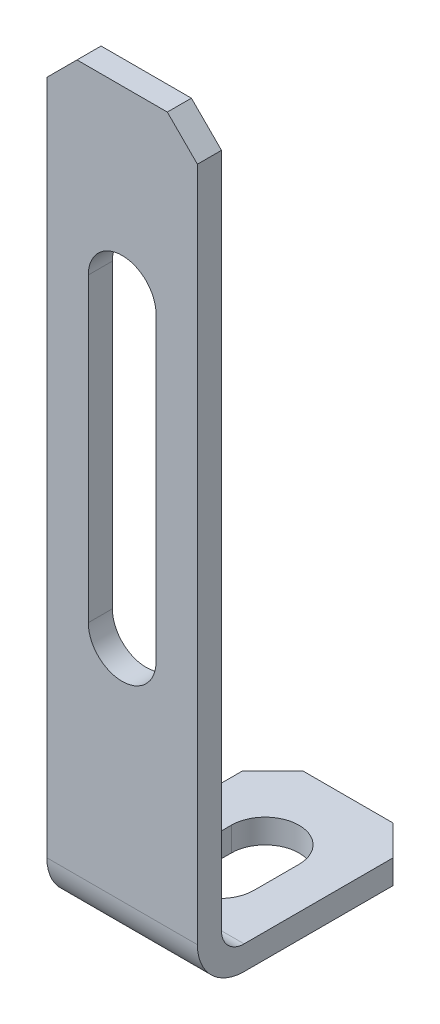
ISO-10303-21;
HEADER;
FILE_DESCRIPTION(('STEP AP214'),'2;1');
FILE_NAME('part.step','',(''),(''),'','','');
FILE_SCHEMA(('AUTOMOTIVE_DESIGN { 1 0 10303 214 1 1 1 1 }'));
ENDSEC;
DATA;
#1=APPLICATION_CONTEXT('core data for automotive mechanical design processes');
#2=APPLICATION_PROTOCOL_DEFINITION('international standard','automotive_design',2000,#1);
#3=PRODUCT_CONTEXT('',#1,'mechanical');
#4=PRODUCT('Part','Part','',(#3));
#5=PRODUCT_RELATED_PRODUCT_CATEGORY('part','',(#4));
#6=PRODUCT_DEFINITION_FORMATION('','',#4);
#7=PRODUCT_DEFINITION_CONTEXT('part definition',#1,'design');
#8=PRODUCT_DEFINITION('design','',#6,#7);
#9=PRODUCT_DEFINITION_SHAPE('','',#8);
#10=(LENGTH_UNIT() NAMED_UNIT(*) SI_UNIT(.MILLI.,.METRE.));
#11=(NAMED_UNIT(*) PLANE_ANGLE_UNIT() SI_UNIT($,.RADIAN.));
#12=(NAMED_UNIT(*) SI_UNIT($,.STERADIAN.) SOLID_ANGLE_UNIT());
#13=UNCERTAINTY_MEASURE_WITH_UNIT(LENGTH_MEASURE(1.E-05),#10,'distance_accuracy_value','');
#14=(GEOMETRIC_REPRESENTATION_CONTEXT(3) GLOBAL_UNCERTAINTY_ASSIGNED_CONTEXT((#13)) GLOBAL_UNIT_ASSIGNED_CONTEXT((#10,
#11,#12)) REPRESENTATION_CONTEXT('',''));
#15=CARTESIAN_POINT('',(0.,0.,0.));
#16=DIRECTION('',(0.,0.,1.));
#17=DIRECTION('',(1.,0.,0.));
#18=AXIS2_PLACEMENT_3D('',#15,#16,#17);
#19=CARTESIAN_POINT('',(0.,50.,-15.));
#20=DIRECTION('',(0.,1.,0.));
#21=DIRECTION('',(0.,0.,1.));
#22=AXIS2_PLACEMENT_3D('',#19,#20,#21);
#23=PLANE('',#22);
#24=DIRECTION('',(-1.,0.,0.));
#25=VECTOR('',#24,1.);
#26=CARTESIAN_POINT('',(10.,50.,-1.6));
#27=LINE('',#26,#25);
#28=CARTESIAN_POINT('',(7.99999999999999,50.,-1.6));
#29=VERTEX_POINT('',#28);
#30=CARTESIAN_POINT('',(1.99999999999998,50.,-1.6));
#31=VERTEX_POINT('',#30);
#32=EDGE_CURVE('E245',#29,#31,#27,.T.);
#33=ORIENTED_EDGE('',*,*,#32,.T.);
#34=DIRECTION('',(0.,0.,1.));
#35=VECTOR('',#34,1.);
#36=CARTESIAN_POINT('',(1.99999999999999,50.,0.));
#37=LINE('',#36,#35);
#38=CARTESIAN_POINT('',(1.99999999999999,50.,0.));
#39=VERTEX_POINT('',#38);
#40=EDGE_CURVE('E276',#31,#39,#37,.T.);
#41=ORIENTED_EDGE('',*,*,#40,.T.);
#42=DIRECTION('',(1.,0.,0.));
#43=VECTOR('',#42,1.);
#44=CARTESIAN_POINT('',(0.,50.,0.));
#45=LINE('',#44,#43);
#46=CARTESIAN_POINT('',(7.99999999999999,50.,0.));
#47=VERTEX_POINT('',#46);
#48=EDGE_CURVE('E257',#39,#47,#45,.T.);
#49=ORIENTED_EDGE('',*,*,#48,.T.);
#50=DIRECTION('',(0.,0.,-1.));
#51=VECTOR('',#50,1.);
#52=CARTESIAN_POINT('',(7.99999999999999,50.,-15.));
#53=LINE('',#52,#51);
#54=EDGE_CURVE('E274',#47,#29,#53,.T.);
#55=ORIENTED_EDGE('',*,*,#54,.T.);
#56=EDGE_LOOP('',(#33,#41,#49,#55));
#57=FACE_BOUND('',#56,.T.);
#58=ADVANCED_FACE('F32',(#57),#23,.T.);
#59=CARTESIAN_POINT('',(0.,0.,-15.));
#60=DIRECTION('',(0.,0.,-1.));
#61=DIRECTION('',(-1.,0.,0.));
#62=AXIS2_PLACEMENT_3D('',#59,#60,#61);
#63=PLANE('',#62);
#64=DIRECTION('',(1.,0.,0.));
#65=VECTOR('',#64,1.);
#66=CARTESIAN_POINT('',(0.,0.,-15.));
#67=LINE('',#66,#65);
#68=CARTESIAN_POINT('',(1.99999999999998,0.,-15.));
#69=VERTEX_POINT('',#68);
#70=CARTESIAN_POINT('',(7.99999999999999,0.,-15.));
#71=VERTEX_POINT('',#70);
#72=EDGE_CURVE('E260',#69,#71,#67,.T.);
#73=ORIENTED_EDGE('',*,*,#72,.F.);
#74=DIRECTION('',(0.,1.,0.));
#75=VECTOR('',#74,1.);
#76=CARTESIAN_POINT('',(1.99999999999999,1.6,-15.));
#77=LINE('',#76,#75);
#78=CARTESIAN_POINT('',(1.99999999999998,1.6,-15.));
#79=VERTEX_POINT('',#78);
#80=EDGE_CURVE('E296',#69,#79,#77,.T.);
#81=ORIENTED_EDGE('',*,*,#80,.T.);
#82=DIRECTION('',(-1.,0.,0.));
#83=VECTOR('',#82,1.);
#84=CARTESIAN_POINT('',(10.,1.6,-15.));
#85=LINE('',#84,#83);
#86=CARTESIAN_POINT('',(7.99999999999999,1.6,-15.));
#87=VERTEX_POINT('',#86);
#88=EDGE_CURVE('E241',#87,#79,#85,.T.);
#89=ORIENTED_EDGE('',*,*,#88,.F.);
#90=DIRECTION('',(0.,-1.,0.));
#91=VECTOR('',#90,1.);
#92=CARTESIAN_POINT('',(7.99999999999999,0.,-15.));
#93=LINE('',#92,#91);
#94=EDGE_CURVE('E294',#87,#71,#93,.T.);
#95=ORIENTED_EDGE('',*,*,#94,.T.);
#96=EDGE_LOOP('',(#73,#81,#89,#95));
#97=FACE_BOUND('',#96,.T.);
#98=ADVANCED_FACE('F356',(#97),#63,.T.);
#99=CARTESIAN_POINT('',(0.,0.,0.));
#100=DIRECTION('',(0.,-1.,0.));
#101=DIRECTION('',(0.,0.,-1.));
#102=AXIS2_PLACEMENT_3D('',#99,#100,#101);
#103=PLANE('',#102);
#104=CARTESIAN_POINT('',(5.,0.,-9.5));
#105=DIRECTION('',(0.,1.,0.));
#106=DIRECTION('',(0.,0.,1.));
#107=AXIS2_PLACEMENT_3D('',#104,#105,#106);
#108=CIRCLE('',#107,2.25);
#109=CARTESIAN_POINT('',(7.25,0.,-9.5));
#110=VERTEX_POINT('',#109);
#111=CARTESIAN_POINT('',(2.75,0.,-9.5));
#112=VERTEX_POINT('',#111);
#113=EDGE_CURVE('E203',#110,#112,#108,.T.);
#114=ORIENTED_EDGE('',*,*,#113,.T.);
#115=DIRECTION('',(0.,0.,1.));
#116=VECTOR('',#115,1.);
#117=CARTESIAN_POINT('',(2.75,0.,-9.5));
#118=LINE('',#117,#116);
#119=CARTESIAN_POINT('',(2.75,0.,-6.5));
#120=VERTEX_POINT('',#119);
#121=EDGE_CURVE('E206',#112,#120,#118,.T.);
#122=ORIENTED_EDGE('',*,*,#121,.T.);
#123=CARTESIAN_POINT('',(5.,0.,-6.5));
#124=DIRECTION('',(0.,1.,0.));
#125=DIRECTION('',(0.,0.,1.));
#126=AXIS2_PLACEMENT_3D('',#123,#124,#125);
#127=CIRCLE('',#126,2.25);
#128=CARTESIAN_POINT('',(7.25,0.,-6.5));
#129=VERTEX_POINT('',#128);
#130=EDGE_CURVE('E210',#120,#129,#127,.T.);
#131=ORIENTED_EDGE('',*,*,#130,.T.);
#132=DIRECTION('',(0.,0.,-1.));
#133=VECTOR('',#132,1.);
#134=CARTESIAN_POINT('',(7.25,0.,-6.5));
#135=LINE('',#134,#133);
#136=EDGE_CURVE('E213',#129,#110,#135,.T.);
#137=ORIENTED_EDGE('',*,*,#136,.T.);
#138=EDGE_LOOP('',(#114,#122,#131,#137));
#139=FACE_BOUND('',#138,.T.);
#140=DIRECTION('',(0.,0.,-1.));
#141=VECTOR('',#140,1.);
#142=CARTESIAN_POINT('',(10.,0.,0.));
#143=LINE('',#142,#141);
#144=CARTESIAN_POINT('',(10.,0.,-3.1));
#145=VERTEX_POINT('',#144);
#146=CARTESIAN_POINT('',(10.,0.,-13.));
#147=VERTEX_POINT('',#146);
#148=EDGE_CURVE('E255',#145,#147,#143,.T.);
#149=ORIENTED_EDGE('',*,*,#148,.F.);
#150=DIRECTION('',(1.,0.,0.));
#151=VECTOR('',#150,1.);
#152=CARTESIAN_POINT('',(0.,0.,-3.1));
#153=LINE('',#152,#151);
#154=CARTESIAN_POINT('',(0.,0.,-3.1));
#155=VERTEX_POINT('',#154);
#156=EDGE_CURVE('E40',#145,#155,#153,.F.);
#157=ORIENTED_EDGE('',*,*,#156,.T.);
#158=DIRECTION('',(0.,0.,-1.));
#159=VECTOR('',#158,1.);
#160=CARTESIAN_POINT('',(0.,0.,0.));
#161=LINE('',#160,#159);
#162=CARTESIAN_POINT('',(0.,0.,-13.));
#163=VERTEX_POINT('',#162);
#164=EDGE_CURVE('E254',#155,#163,#161,.T.);
#165=ORIENTED_EDGE('',*,*,#164,.T.);
#166=DIRECTION('',(0.707106781186544,0.,-0.707106781186551));
#167=VECTOR('',#166,1.);
#168=CARTESIAN_POINT('',(-6.5,0.,-6.49999999999993));
#169=LINE('',#168,#167);
#170=EDGE_CURVE('E306',#163,#69,#169,.T.);
#171=ORIENTED_EDGE('',*,*,#170,.T.);
#172=ORIENTED_EDGE('',*,*,#72,.T.);
#173=DIRECTION('',(-0.707106781186551,0.,-0.707106781186544));
#174=VECTOR('',#173,1.);
#175=CARTESIAN_POINT('',(11.5,0.,-11.5000000000001));
#176=LINE('',#175,#174);
#177=EDGE_CURVE('E303',#71,#147,#176,.F.);
#178=ORIENTED_EDGE('',*,*,#177,.T.);
#179=EDGE_LOOP('',(#149,#157,#165,#171,#172,#178));
#180=FACE_BOUND('',#179,.T.);
#181=ADVANCED_FACE('F361',(#139,#180),#103,.T.);
#182=CARTESIAN_POINT('',(0.,50.,0.));
#183=DIRECTION('',(0.,0.,1.));
#184=DIRECTION('',(1.,0.,0.));
#185=AXIS2_PLACEMENT_3D('',#182,#183,#184);
#186=PLANE('',#185);
#187=CARTESIAN_POINT('',(5.,18.,0.));
#188=DIRECTION('',(0.,0.,1.));
#189=DIRECTION('',(1.,0.,0.));
#190=AXIS2_PLACEMENT_3D('',#187,#188,#189);
#191=CIRCLE('',#190,2.25);
#192=CARTESIAN_POINT('',(2.75,18.,0.));
#193=VERTEX_POINT('',#192);
#194=CARTESIAN_POINT('',(7.25,18.,0.));
#195=VERTEX_POINT('',#194);
#196=EDGE_CURVE('E188',#193,#195,#191,.T.);
#197=ORIENTED_EDGE('',*,*,#196,.F.);
#198=DIRECTION('',(0.,-1.,0.));
#199=VECTOR('',#198,1.);
#200=CARTESIAN_POINT('',(2.75,38.,0.));
#201=LINE('',#200,#199);
#202=CARTESIAN_POINT('',(2.75,38.,0.));
#203=VERTEX_POINT('',#202);
#204=EDGE_CURVE('E193',#203,#193,#201,.T.);
#205=ORIENTED_EDGE('',*,*,#204,.F.);
#206=CARTESIAN_POINT('',(5.,38.,0.));
#207=DIRECTION('',(0.,0.,1.));
#208=DIRECTION('',(1.,0.,0.));
#209=AXIS2_PLACEMENT_3D('',#206,#207,#208);
#210=CIRCLE('',#209,2.25);
#211=CARTESIAN_POINT('',(7.25,38.,0.));
#212=VERTEX_POINT('',#211);
#213=EDGE_CURVE('E172',#212,#203,#210,.T.);
#214=ORIENTED_EDGE('',*,*,#213,.F.);
#215=DIRECTION('',(0.,1.,0.));
#216=VECTOR('',#215,1.);
#217=CARTESIAN_POINT('',(7.25,18.,0.));
#218=LINE('',#217,#216);
#219=EDGE_CURVE('E183',#195,#212,#218,.T.);
#220=ORIENTED_EDGE('',*,*,#219,.F.);
#221=EDGE_LOOP('',(#197,#205,#214,#220));
#222=FACE_BOUND('',#221,.T.);
#223=DIRECTION('',(0.,-1.,0.));
#224=VECTOR('',#223,1.);
#225=CARTESIAN_POINT('',(0.,50.,0.));
#226=LINE('',#225,#224);
#227=CARTESIAN_POINT('',(0.,48.,0.));
#228=VERTEX_POINT('',#227);
#229=CARTESIAN_POINT('',(0.,3.1,0.));
#230=VERTEX_POINT('',#229);
#231=EDGE_CURVE('E251',#228,#230,#226,.T.);
#232=ORIENTED_EDGE('',*,*,#231,.T.);
#233=DIRECTION('',(1.,0.,0.));
#234=VECTOR('',#233,1.);
#235=CARTESIAN_POINT('',(0.,3.1,0.));
#236=LINE('',#235,#234);
#237=CARTESIAN_POINT('',(10.,3.1,0.));
#238=VERTEX_POINT('',#237);
#239=EDGE_CURVE('E323',#230,#238,#236,.T.);
#240=ORIENTED_EDGE('',*,*,#239,.T.);
#241=DIRECTION('',(0.,-1.,0.));
#242=VECTOR('',#241,1.);
#243=CARTESIAN_POINT('',(10.,50.,0.));
#244=LINE('',#243,#242);
#245=CARTESIAN_POINT('',(10.,48.,0.));
#246=VERTEX_POINT('',#245);
#247=EDGE_CURVE('E248',#246,#238,#244,.T.);
#248=ORIENTED_EDGE('',*,*,#247,.F.);
#249=DIRECTION('',(0.707106781186551,-0.707106781186544,0.));
#250=VECTOR('',#249,1.);
#251=CARTESIAN_POINT('',(3.99999999999995,54.,0.));
#252=LINE('',#251,#250);
#253=EDGE_CURVE('E279',#246,#47,#252,.F.);
#254=ORIENTED_EDGE('',*,*,#253,.T.);
#255=ORIENTED_EDGE('',*,*,#48,.F.);
#256=DIRECTION('',(-0.707106781186544,-0.707106781186551,0.));
#257=VECTOR('',#256,1.);
#258=CARTESIAN_POINT('',(1.,49.,0.));
#259=LINE('',#258,#257);
#260=EDGE_CURVE('E281',#39,#228,#259,.T.);
#261=ORIENTED_EDGE('',*,*,#260,.T.);
#262=EDGE_LOOP('',(#232,#240,#248,#254,#255,#261));
#263=FACE_BOUND('',#262,.T.);
#264=ADVANCED_FACE('F190',(#222,#263),#186,.T.);
#265=CARTESIAN_POINT('',(0.,0.,0.));
#266=DIRECTION('',(1.,0.,0.));
#267=DIRECTION('',(0.,0.,-1.));
#268=AXIS2_PLACEMENT_3D('',#265,#266,#267);
#269=PLANE('',#268);
#270=ORIENTED_EDGE('',*,*,#164,.F.);
#271=CARTESIAN_POINT('',(0.,3.1,-3.1));
#272=DIRECTION('',(1.,0.,0.));
#273=DIRECTION('',(0.,0.,-1.));
#274=AXIS2_PLACEMENT_3D('',#271,#272,#273);
#275=CIRCLE('',#274,3.1);
#276=EDGE_CURVE('E11',#155,#230,#275,.F.);
#277=ORIENTED_EDGE('',*,*,#276,.T.);
#278=ORIENTED_EDGE('',*,*,#231,.F.);
#279=DIRECTION('',(0.,0.,-1.));
#280=VECTOR('',#279,1.);
#281=CARTESIAN_POINT('',(0.,48.,-1.6));
#282=LINE('',#281,#280);
#283=CARTESIAN_POINT('',(0.,48.,-1.6));
#284=VERTEX_POINT('',#283);
#285=EDGE_CURVE('E286',#228,#284,#282,.T.);
#286=ORIENTED_EDGE('',*,*,#285,.T.);
#287=DIRECTION('',(0.,1.,0.));
#288=VECTOR('',#287,1.);
#289=CARTESIAN_POINT('',(0.,1.6,-1.6));
#290=LINE('',#289,#288);
#291=CARTESIAN_POINT('',(0.,3.1,-1.6));
#292=VERTEX_POINT('',#291);
#293=EDGE_CURVE('E239',#292,#284,#290,.T.);
#294=ORIENTED_EDGE('',*,*,#293,.F.);
#295=CARTESIAN_POINT('',(0.,3.1,-3.1));
#296=DIRECTION('',(1.,0.,0.));
#297=DIRECTION('',(0.,0.,-1.));
#298=AXIS2_PLACEMENT_3D('',#295,#296,#297);
#299=CIRCLE('',#298,1.5);
#300=CARTESIAN_POINT('',(0.,1.6,-3.1));
#301=VERTEX_POINT('',#300);
#302=EDGE_CURVE('E319',#292,#301,#299,.T.);
#303=ORIENTED_EDGE('',*,*,#302,.T.);
#304=DIRECTION('',(0.,0.,1.));
#305=VECTOR('',#304,1.);
#306=CARTESIAN_POINT('',(0.,1.6,-15.));
#307=LINE('',#306,#305);
#308=CARTESIAN_POINT('',(0.,1.6,-13.));
#309=VERTEX_POINT('',#308);
#310=EDGE_CURVE('E228',#309,#301,#307,.T.);
#311=ORIENTED_EDGE('',*,*,#310,.F.);
#312=DIRECTION('',(0.,-1.,0.));
#313=VECTOR('',#312,1.);
#314=CARTESIAN_POINT('',(0.,0.,-13.));
#315=LINE('',#314,#313);
#316=EDGE_CURVE('E283',#309,#163,#315,.T.);
#317=ORIENTED_EDGE('',*,*,#316,.T.);
#318=EDGE_LOOP('',(#270,#277,#278,#286,#294,#303,#311,#317));
#319=FACE_BOUND('',#318,.T.);
#320=ADVANCED_FACE('F347',(#319),#269,.F.);
#321=CARTESIAN_POINT('',(10.,0.,0.));
#322=DIRECTION('',(1.,0.,0.));
#323=DIRECTION('',(0.,0.,-1.));
#324=AXIS2_PLACEMENT_3D('',#321,#322,#323);
#325=PLANE('',#324);
#326=ORIENTED_EDGE('',*,*,#247,.T.);
#327=CARTESIAN_POINT('',(10.,3.1,-3.1));
#328=DIRECTION('',(1.,0.,0.));
#329=DIRECTION('',(0.,0.,-1.));
#330=AXIS2_PLACEMENT_3D('',#327,#328,#329);
#331=CIRCLE('',#330,3.1);
#332=EDGE_CURVE('E54',#238,#145,#331,.T.);
#333=ORIENTED_EDGE('',*,*,#332,.T.);
#334=ORIENTED_EDGE('',*,*,#148,.T.);
#335=DIRECTION('',(0.,1.,0.));
#336=VECTOR('',#335,1.);
#337=CARTESIAN_POINT('',(10.,0.,-13.));
#338=LINE('',#337,#336);
#339=CARTESIAN_POINT('',(10.,1.6,-13.));
#340=VERTEX_POINT('',#339);
#341=EDGE_CURVE('E311',#147,#340,#338,.T.);
#342=ORIENTED_EDGE('',*,*,#341,.T.);
#343=DIRECTION('',(0.,0.,1.));
#344=VECTOR('',#343,1.);
#345=CARTESIAN_POINT('',(10.,1.6,-15.));
#346=LINE('',#345,#344);
#347=CARTESIAN_POINT('',(10.,1.6,-3.1));
#348=VERTEX_POINT('',#347);
#349=EDGE_CURVE('E235',#340,#348,#346,.T.);
#350=ORIENTED_EDGE('',*,*,#349,.T.);
#351=CARTESIAN_POINT('',(10.,3.1,-3.1));
#352=DIRECTION('',(1.,0.,0.));
#353=DIRECTION('',(0.,0.,-1.));
#354=AXIS2_PLACEMENT_3D('',#351,#352,#353);
#355=CIRCLE('',#354,1.5);
#356=CARTESIAN_POINT('',(10.,3.1,-1.6));
#357=VERTEX_POINT('',#356);
#358=EDGE_CURVE('E321',#348,#357,#355,.F.);
#359=ORIENTED_EDGE('',*,*,#358,.T.);
#360=DIRECTION('',(0.,1.,0.));
#361=VECTOR('',#360,1.);
#362=CARTESIAN_POINT('',(10.,1.6,-1.6));
#363=LINE('',#362,#361);
#364=CARTESIAN_POINT('',(10.,48.,-1.6));
#365=VERTEX_POINT('',#364);
#366=EDGE_CURVE('E238',#357,#365,#363,.T.);
#367=ORIENTED_EDGE('',*,*,#366,.T.);
#368=DIRECTION('',(0.,0.,1.));
#369=VECTOR('',#368,1.);
#370=CARTESIAN_POINT('',(10.,48.,0.));
#371=LINE('',#370,#369);
#372=EDGE_CURVE('E308',#365,#246,#371,.T.);
#373=ORIENTED_EDGE('',*,*,#372,.T.);
#374=EDGE_LOOP('',(#326,#333,#334,#342,#350,#359,#367,#373));
#375=FACE_BOUND('',#374,.T.);
#376=ADVANCED_FACE('F331',(#375),#325,.T.);
#377=CARTESIAN_POINT('',(10.,1.6,-1.6));
#378=DIRECTION('',(0.,0.,1.));
#379=DIRECTION('',(1.,0.,0.));
#380=AXIS2_PLACEMENT_3D('',#377,#378,#379);
#381=PLANE('',#380);
#382=DIRECTION('',(0.,-1.,0.));
#383=VECTOR('',#382,1.);
#384=CARTESIAN_POINT('',(2.75,1.6,-1.6));
#385=LINE('',#384,#383);
#386=CARTESIAN_POINT('',(2.75,38.,-1.6));
#387=VERTEX_POINT('',#386);
#388=CARTESIAN_POINT('',(2.75,18.,-1.6));
#389=VERTEX_POINT('',#388);
#390=EDGE_CURVE('E268',#387,#389,#385,.T.);
#391=ORIENTED_EDGE('',*,*,#390,.T.);
#392=CARTESIAN_POINT('',(5.,18.,-1.6));
#393=DIRECTION('',(0.,0.,1.));
#394=DIRECTION('',(1.,0.,0.));
#395=AXIS2_PLACEMENT_3D('',#392,#393,#394);
#396=CIRCLE('',#395,2.25);
#397=CARTESIAN_POINT('',(7.25,18.,-1.6));
#398=VERTEX_POINT('',#397);
#399=EDGE_CURVE('E271',#389,#398,#396,.T.);
#400=ORIENTED_EDGE('',*,*,#399,.T.);
#401=DIRECTION('',(0.,1.,0.));
#402=VECTOR('',#401,1.);
#403=CARTESIAN_POINT('',(7.25,1.6,-1.6));
#404=LINE('',#403,#402);
#405=CARTESIAN_POINT('',(7.25,38.,-1.6));
#406=VERTEX_POINT('',#405);
#407=EDGE_CURVE('E263',#398,#406,#404,.T.);
#408=ORIENTED_EDGE('',*,*,#407,.T.);
#409=CARTESIAN_POINT('',(5.,38.,-1.6));
#410=DIRECTION('',(0.,0.,1.));
#411=DIRECTION('',(1.,0.,0.));
#412=AXIS2_PLACEMENT_3D('',#409,#410,#411);
#413=CIRCLE('',#412,2.25);
#414=EDGE_CURVE('E175',#406,#387,#413,.T.);
#415=ORIENTED_EDGE('',*,*,#414,.T.);
#416=EDGE_LOOP('',(#391,#400,#408,#415));
#417=FACE_BOUND('',#416,.T.);
#418=ORIENTED_EDGE('',*,*,#366,.F.);
#419=DIRECTION('',(-1.,0.,0.));
#420=VECTOR('',#419,1.);
#421=CARTESIAN_POINT('',(0.,3.1,-1.6));
#422=LINE('',#421,#420);
#423=EDGE_CURVE('E314',#357,#292,#422,.T.);
#424=ORIENTED_EDGE('',*,*,#423,.T.);
#425=ORIENTED_EDGE('',*,*,#293,.T.);
#426=DIRECTION('',(0.707106781186544,0.707106781186551,0.));
#427=VECTOR('',#426,1.);
#428=CARTESIAN_POINT('',(1.99999999999999,50.,-1.6));
#429=LINE('',#428,#427);
#430=EDGE_CURVE('E292',#284,#31,#429,.T.);
#431=ORIENTED_EDGE('',*,*,#430,.T.);
#432=ORIENTED_EDGE('',*,*,#32,.F.);
#433=DIRECTION('',(-0.707106781186551,0.707106781186544,0.));
#434=VECTOR('',#433,1.);
#435=CARTESIAN_POINT('',(10.,48.,-1.6));
#436=LINE('',#435,#434);
#437=EDGE_CURVE('E289',#29,#365,#436,.F.);
#438=ORIENTED_EDGE('',*,*,#437,.T.);
#439=EDGE_LOOP('',(#418,#424,#425,#431,#432,#438));
#440=FACE_BOUND('',#439,.T.);
#441=ADVANCED_FACE('F425',(#417,#440),#381,.F.);
#442=CARTESIAN_POINT('',(10.,1.6,-15.));
#443=DIRECTION('',(0.,-1.,0.));
#444=DIRECTION('',(0.,0.,-1.));
#445=AXIS2_PLACEMENT_3D('',#442,#443,#444);
#446=PLANE('',#445);
#447=DIRECTION('',(0.,0.,1.));
#448=VECTOR('',#447,1.);
#449=CARTESIAN_POINT('',(2.75,1.6,-9.5));
#450=LINE('',#449,#448);
#451=CARTESIAN_POINT('',(2.75,1.6,-9.5));
#452=VERTEX_POINT('',#451);
#453=CARTESIAN_POINT('',(2.75,1.6,-6.5));
#454=VERTEX_POINT('',#453);
#455=EDGE_CURVE('E218',#452,#454,#450,.T.);
#456=ORIENTED_EDGE('',*,*,#455,.F.);
#457=CARTESIAN_POINT('',(5.,1.6,-9.5));
#458=DIRECTION('',(0.,1.,0.));
#459=DIRECTION('',(0.,0.,1.));
#460=AXIS2_PLACEMENT_3D('',#457,#458,#459);
#461=CIRCLE('',#460,2.25);
#462=CARTESIAN_POINT('',(7.25,1.6,-9.5));
#463=VERTEX_POINT('',#462);
#464=EDGE_CURVE('E200',#463,#452,#461,.T.);
#465=ORIENTED_EDGE('',*,*,#464,.F.);
#466=DIRECTION('',(0.,0.,-1.));
#467=VECTOR('',#466,1.);
#468=CARTESIAN_POINT('',(7.25,1.6,-6.5));
#469=LINE('',#468,#467);
#470=CARTESIAN_POINT('',(7.25,1.6,-6.5));
#471=VERTEX_POINT('',#470);
#472=EDGE_CURVE('E207',#471,#463,#469,.T.);
#473=ORIENTED_EDGE('',*,*,#472,.F.);
#474=CARTESIAN_POINT('',(5.,1.6,-6.5));
#475=DIRECTION('',(0.,1.,0.));
#476=DIRECTION('',(0.,0.,1.));
#477=AXIS2_PLACEMENT_3D('',#474,#475,#476);
#478=CIRCLE('',#477,2.25);
#479=EDGE_CURVE('E221',#454,#471,#478,.T.);
#480=ORIENTED_EDGE('',*,*,#479,.F.);
#481=EDGE_LOOP('',(#456,#465,#473,#480));
#482=FACE_BOUND('',#481,.T.);
#483=ORIENTED_EDGE('',*,*,#310,.T.);
#484=DIRECTION('',(-1.,0.,0.));
#485=VECTOR('',#484,1.);
#486=CARTESIAN_POINT('',(10.,1.6,-3.1));
#487=LINE('',#486,#485);
#488=EDGE_CURVE('E317',#301,#348,#487,.F.);
#489=ORIENTED_EDGE('',*,*,#488,.T.);
#490=ORIENTED_EDGE('',*,*,#349,.F.);
#491=DIRECTION('',(0.707106781186551,0.,0.707106781186544));
#492=VECTOR('',#491,1.);
#493=CARTESIAN_POINT('',(10.,1.6,-13.));
#494=LINE('',#493,#492);
#495=EDGE_CURVE('E299',#340,#87,#494,.F.);
#496=ORIENTED_EDGE('',*,*,#495,.T.);
#497=ORIENTED_EDGE('',*,*,#88,.T.);
#498=DIRECTION('',(-0.707106781186544,0.,0.707106781186551));
#499=VECTOR('',#498,1.);
#500=CARTESIAN_POINT('',(1.99999999999999,1.6,-15.));
#501=LINE('',#500,#499);
#502=EDGE_CURVE('E301',#79,#309,#501,.T.);
#503=ORIENTED_EDGE('',*,*,#502,.T.);
#504=EDGE_LOOP('',(#483,#489,#490,#496,#497,#503));
#505=FACE_BOUND('',#504,.T.);
#506=ADVANCED_FACE('F394',(#482,#505),#446,.F.);
#507=CARTESIAN_POINT('',(5.,0.,-9.5));
#508=DIRECTION('',(0.,1.,0.));
#509=DIRECTION('',(0.,0.,1.));
#510=AXIS2_PLACEMENT_3D('',#507,#508,#509);
#511=CYLINDRICAL_SURFACE('',#510,2.25);
#512=ORIENTED_EDGE('',*,*,#464,.T.);
#513=DIRECTION('',(0.,1.,0.));
#514=VECTOR('',#513,1.);
#515=CARTESIAN_POINT('',(2.75,0.,-9.5));
#516=LINE('',#515,#514);
#517=EDGE_CURVE('E216',#112,#452,#516,.T.);
#518=ORIENTED_EDGE('',*,*,#517,.F.);
#519=ORIENTED_EDGE('',*,*,#113,.F.);
#520=DIRECTION('',(0.,1.,0.));
#521=VECTOR('',#520,1.);
#522=CARTESIAN_POINT('',(7.25,0.,-9.5));
#523=LINE('',#522,#521);
#524=EDGE_CURVE('E226',#110,#463,#523,.T.);
#525=ORIENTED_EDGE('',*,*,#524,.T.);
#526=EDGE_LOOP('',(#512,#518,#519,#525));
#527=FACE_BOUND('',#526,.T.);
#528=ADVANCED_FACE('F441',(#527),#511,.F.);
#529=CARTESIAN_POINT('',(7.25,0.,-6.5));
#530=DIRECTION('',(1.,0.,0.));
#531=DIRECTION('',(0.,0.,-1.));
#532=AXIS2_PLACEMENT_3D('',#529,#530,#531);
#533=PLANE('',#532);
#534=ORIENTED_EDGE('',*,*,#472,.T.);
#535=ORIENTED_EDGE('',*,*,#524,.F.);
#536=ORIENTED_EDGE('',*,*,#136,.F.);
#537=DIRECTION('',(0.,1.,0.));
#538=VECTOR('',#537,1.);
#539=CARTESIAN_POINT('',(7.25,0.,-6.5));
#540=LINE('',#539,#538);
#541=EDGE_CURVE('E229',#129,#471,#540,.T.);
#542=ORIENTED_EDGE('',*,*,#541,.T.);
#543=EDGE_LOOP('',(#534,#535,#536,#542));
#544=FACE_BOUND('',#543,.T.);
#545=ADVANCED_FACE('F447',(#544),#533,.F.);
#546=CARTESIAN_POINT('',(5.,0.,-6.5));
#547=DIRECTION('',(0.,1.,0.));
#548=DIRECTION('',(0.,0.,1.));
#549=AXIS2_PLACEMENT_3D('',#546,#547,#548);
#550=CYLINDRICAL_SURFACE('',#549,2.25);
#551=ORIENTED_EDGE('',*,*,#479,.T.);
#552=ORIENTED_EDGE('',*,*,#541,.F.);
#553=ORIENTED_EDGE('',*,*,#130,.F.);
#554=DIRECTION('',(0.,1.,0.));
#555=VECTOR('',#554,1.);
#556=CARTESIAN_POINT('',(2.75,0.,-6.5));
#557=LINE('',#556,#555);
#558=EDGE_CURVE('E231',#120,#454,#557,.T.);
#559=ORIENTED_EDGE('',*,*,#558,.T.);
#560=EDGE_LOOP('',(#551,#552,#553,#559));
#561=FACE_BOUND('',#560,.T.);
#562=ADVANCED_FACE('F455',(#561),#550,.F.);
#563=CARTESIAN_POINT('',(2.75,0.,-9.5));
#564=DIRECTION('',(-1.,0.,0.));
#565=DIRECTION('',(0.,0.,1.));
#566=AXIS2_PLACEMENT_3D('',#563,#564,#565);
#567=PLANE('',#566);
#568=ORIENTED_EDGE('',*,*,#455,.T.);
#569=ORIENTED_EDGE('',*,*,#558,.F.);
#570=ORIENTED_EDGE('',*,*,#121,.F.);
#571=ORIENTED_EDGE('',*,*,#517,.T.);
#572=EDGE_LOOP('',(#568,#569,#570,#571));
#573=FACE_BOUND('',#572,.T.);
#574=ADVANCED_FACE('F463',(#573),#567,.F.);
#575=CARTESIAN_POINT('',(5.,18.,-15.));
#576=DIRECTION('',(0.,0.,1.));
#577=DIRECTION('',(1.,0.,0.));
#578=AXIS2_PLACEMENT_3D('',#575,#576,#577);
#579=CYLINDRICAL_SURFACE('',#578,2.25);
#580=DIRECTION('',(0.,0.,1.));
#581=VECTOR('',#580,1.);
#582=CARTESIAN_POINT('',(2.75,18.,-15.));
#583=LINE('',#582,#581);
#584=EDGE_CURVE('E198',#389,#193,#583,.T.);
#585=ORIENTED_EDGE('',*,*,#584,.T.);
#586=ORIENTED_EDGE('',*,*,#196,.T.);
#587=DIRECTION('',(0.,0.,1.));
#588=VECTOR('',#587,1.);
#589=CARTESIAN_POINT('',(7.25,18.,-15.));
#590=LINE('',#589,#588);
#591=EDGE_CURVE('E179',#398,#195,#590,.T.);
#592=ORIENTED_EDGE('',*,*,#591,.F.);
#593=ORIENTED_EDGE('',*,*,#399,.F.);
#594=EDGE_LOOP('',(#585,#586,#592,#593));
#595=FACE_BOUND('',#594,.T.);
#596=ADVANCED_FACE('F471',(#595),#579,.F.);
#597=CARTESIAN_POINT('',(2.75,38.,-15.));
#598=DIRECTION('',(-1.,0.,0.));
#599=DIRECTION('',(0.,0.,1.));
#600=AXIS2_PLACEMENT_3D('',#597,#598,#599);
#601=PLANE('',#600);
#602=DIRECTION('',(0.,0.,1.));
#603=VECTOR('',#602,1.);
#604=CARTESIAN_POINT('',(2.75,38.,-15.));
#605=LINE('',#604,#603);
#606=EDGE_CURVE('E178',#387,#203,#605,.T.);
#607=ORIENTED_EDGE('',*,*,#606,.T.);
#608=ORIENTED_EDGE('',*,*,#204,.T.);
#609=ORIENTED_EDGE('',*,*,#584,.F.);
#610=ORIENTED_EDGE('',*,*,#390,.F.);
#611=EDGE_LOOP('',(#607,#608,#609,#610));
#612=FACE_BOUND('',#611,.T.);
#613=ADVANCED_FACE('F479',(#612),#601,.F.);
#614=CARTESIAN_POINT('',(5.,38.,-15.));
#615=DIRECTION('',(0.,0.,1.));
#616=DIRECTION('',(1.,0.,0.));
#617=AXIS2_PLACEMENT_3D('',#614,#615,#616);
#618=CYLINDRICAL_SURFACE('',#617,2.25);
#619=DIRECTION('',(0.,0.,1.));
#620=VECTOR('',#619,1.);
#621=CARTESIAN_POINT('',(7.25,38.,-15.));
#622=LINE('',#621,#620);
#623=EDGE_CURVE('E167',#406,#212,#622,.T.);
#624=ORIENTED_EDGE('',*,*,#623,.T.);
#625=ORIENTED_EDGE('',*,*,#213,.T.);
#626=ORIENTED_EDGE('',*,*,#606,.F.);
#627=ORIENTED_EDGE('',*,*,#414,.F.);
#628=EDGE_LOOP('',(#624,#625,#626,#627));
#629=FACE_BOUND('',#628,.T.);
#630=ADVANCED_FACE('F169',(#629),#618,.F.);
#631=CARTESIAN_POINT('',(7.25,18.,-15.));
#632=DIRECTION('',(1.,0.,0.));
#633=DIRECTION('',(0.,0.,-1.));
#634=AXIS2_PLACEMENT_3D('',#631,#632,#633);
#635=PLANE('',#634);
#636=ORIENTED_EDGE('',*,*,#591,.T.);
#637=ORIENTED_EDGE('',*,*,#219,.T.);
#638=ORIENTED_EDGE('',*,*,#623,.F.);
#639=ORIENTED_EDGE('',*,*,#407,.F.);
#640=EDGE_LOOP('',(#636,#637,#638,#639));
#641=FACE_BOUND('',#640,.T.);
#642=ADVANCED_FACE('F184',(#641),#635,.F.);
#643=CARTESIAN_POINT('',(1.99999999999999,50.,-15.));
#644=DIRECTION('',(-0.707106781186551,0.707106781186544,0.));
#645=DIRECTION('',(0.,0.,-1.));
#646=AXIS2_PLACEMENT_3D('',#643,#644,#645);
#647=PLANE('',#646);
#648=ORIENTED_EDGE('',*,*,#430,.F.);
#649=ORIENTED_EDGE('',*,*,#285,.F.);
#650=ORIENTED_EDGE('',*,*,#260,.F.);
#651=ORIENTED_EDGE('',*,*,#40,.F.);
#652=EDGE_LOOP('',(#648,#649,#650,#651));
#653=FACE_BOUND('',#652,.T.);
#654=ADVANCED_FACE('F344',(#653),#647,.T.);
#655=CARTESIAN_POINT('',(1.99999999999999,0.,-15.));
#656=DIRECTION('',(-0.707106781186551,0.,-0.707106781186544));
#657=DIRECTION('',(0.,-1.,0.));
#658=AXIS2_PLACEMENT_3D('',#655,#656,#657);
#659=PLANE('',#658);
#660=ORIENTED_EDGE('',*,*,#170,.F.);
#661=ORIENTED_EDGE('',*,*,#316,.F.);
#662=ORIENTED_EDGE('',*,*,#502,.F.);
#663=ORIENTED_EDGE('',*,*,#80,.F.);
#664=EDGE_LOOP('',(#660,#661,#662,#663));
#665=FACE_BOUND('',#664,.T.);
#666=ADVANCED_FACE('F369',(#665),#659,.T.);
#667=CARTESIAN_POINT('',(10.,0.,-13.));
#668=DIRECTION('',(-0.707106781186544,0.,0.707106781186551));
#669=DIRECTION('',(0.,1.,0.));
#670=AXIS2_PLACEMENT_3D('',#667,#668,#669);
#671=PLANE('',#670);
#672=ORIENTED_EDGE('',*,*,#177,.F.);
#673=ORIENTED_EDGE('',*,*,#94,.F.);
#674=ORIENTED_EDGE('',*,*,#495,.F.);
#675=ORIENTED_EDGE('',*,*,#341,.F.);
#676=EDGE_LOOP('',(#672,#673,#674,#675));
#677=FACE_BOUND('',#676,.T.);
#678=ADVANCED_FACE('F372',(#677),#671,.F.);
#679=CARTESIAN_POINT('',(10.,48.,0.));
#680=DIRECTION('',(-0.707106781186544,-0.707106781186551,0.));
#681=DIRECTION('',(0.,0.,1.));
#682=AXIS2_PLACEMENT_3D('',#679,#680,#681);
#683=PLANE('',#682);
#684=ORIENTED_EDGE('',*,*,#437,.F.);
#685=ORIENTED_EDGE('',*,*,#54,.F.);
#686=ORIENTED_EDGE('',*,*,#253,.F.);
#687=ORIENTED_EDGE('',*,*,#372,.F.);
#688=EDGE_LOOP('',(#684,#685,#686,#687));
#689=FACE_BOUND('',#688,.T.);
#690=ADVANCED_FACE('F336',(#689),#683,.F.);
#691=CARTESIAN_POINT('',(10.,3.1,-3.1));
#692=DIRECTION('',(1.,0.,0.));
#693=DIRECTION('',(0.,0.,-1.));
#694=AXIS2_PLACEMENT_3D('',#691,#692,#693);
#695=CYLINDRICAL_SURFACE('',#694,1.5);
#696=ORIENTED_EDGE('',*,*,#358,.F.);
#697=ORIENTED_EDGE('',*,*,#488,.F.);
#698=ORIENTED_EDGE('',*,*,#302,.F.);
#699=ORIENTED_EDGE('',*,*,#423,.F.);
#700=EDGE_LOOP('',(#696,#697,#698,#699));
#701=FACE_BOUND('',#700,.T.);
#702=ADVANCED_FACE('F350',(#701),#695,.F.);
#703=CARTESIAN_POINT('',(0.,3.1,-3.1));
#704=DIRECTION('',(1.,0.,0.));
#705=DIRECTION('',(0.,0.,-1.));
#706=AXIS2_PLACEMENT_3D('',#703,#704,#705);
#707=CYLINDRICAL_SURFACE('',#706,3.1);
#708=ORIENTED_EDGE('',*,*,#276,.F.);
#709=ORIENTED_EDGE('',*,*,#156,.F.);
#710=ORIENTED_EDGE('',*,*,#332,.F.);
#711=ORIENTED_EDGE('',*,*,#239,.F.);
#712=EDGE_LOOP('',(#708,#709,#710,#711));
#713=FACE_BOUND('',#712,.T.);
#714=ADVANCED_FACE('F34',(#713),#707,.T.);
#715=CLOSED_SHELL('',(#58,#98,#181,#264,#320,#376,#441,#506,#528,#545,#562,#574,#596,#613,#630,
#642,#654,#666,#678,#690,#702,#714));
#716=MANIFOLD_SOLID_BREP('B2',#715);
#717=ADVANCED_BREP_SHAPE_REPRESENTATION('',(#18,#716),#14);
#718=SHAPE_DEFINITION_REPRESENTATION(#9,#717);
ENDSEC;
END-ISO-10303-21;
